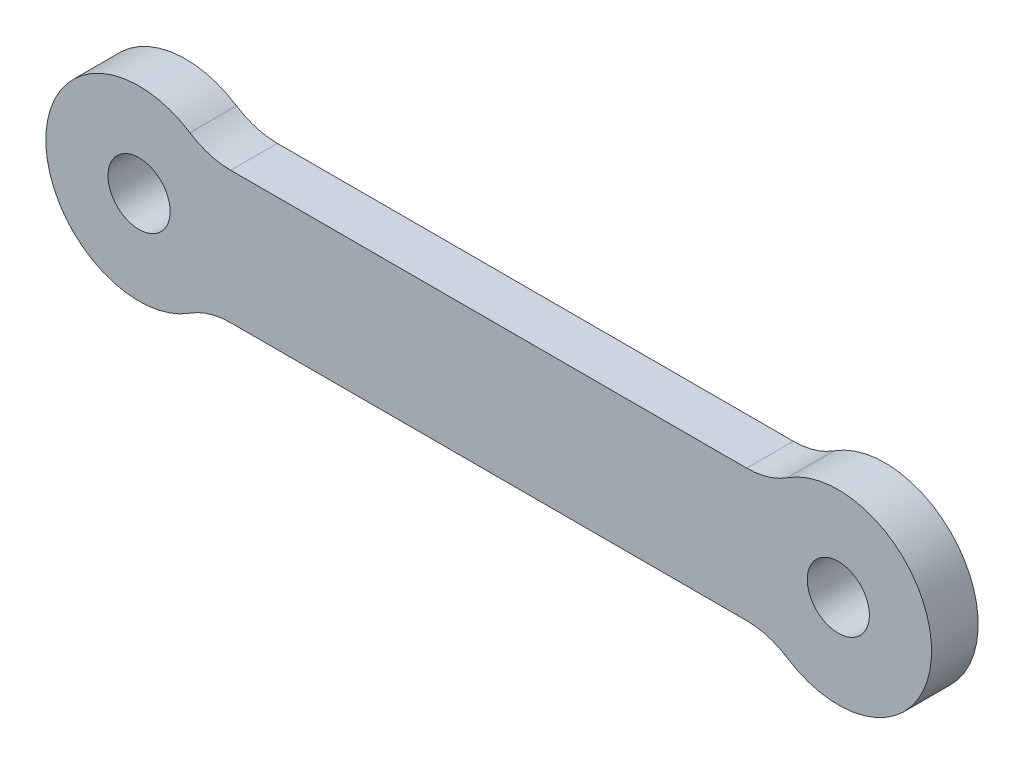
ISO-10303-21;
HEADER;
FILE_DESCRIPTION(('STEP AP214'),'2;1');
FILE_NAME('part.step','',(''),(''),'','','');
FILE_SCHEMA(('AUTOMOTIVE_DESIGN { 1 0 10303 214 1 1 1 1 }'));
ENDSEC;
DATA;
#1=APPLICATION_CONTEXT('core data for automotive mechanical design processes');
#2=APPLICATION_PROTOCOL_DEFINITION('international standard','automotive_design',2000,#1);
#3=PRODUCT_CONTEXT('',#1,'mechanical');
#4=PRODUCT('Part','Part','',(#3));
#5=PRODUCT_RELATED_PRODUCT_CATEGORY('part','',(#4));
#6=PRODUCT_DEFINITION_FORMATION('','',#4);
#7=PRODUCT_DEFINITION_CONTEXT('part definition',#1,'design');
#8=PRODUCT_DEFINITION('design','',#6,#7);
#9=PRODUCT_DEFINITION_SHAPE('','',#8);
#10=(LENGTH_UNIT() NAMED_UNIT(*) SI_UNIT(.MILLI.,.METRE.));
#11=(NAMED_UNIT(*) PLANE_ANGLE_UNIT() SI_UNIT($,.RADIAN.));
#12=(NAMED_UNIT(*) SI_UNIT($,.STERADIAN.) SOLID_ANGLE_UNIT());
#13=UNCERTAINTY_MEASURE_WITH_UNIT(LENGTH_MEASURE(1.E-05),#10,'distance_accuracy_value','');
#14=(GEOMETRIC_REPRESENTATION_CONTEXT(3) GLOBAL_UNCERTAINTY_ASSIGNED_CONTEXT((#13)) GLOBAL_UNIT_ASSIGNED_CONTEXT((#10,
#11,#12)) REPRESENTATION_CONTEXT('',''));
#15=CARTESIAN_POINT('',(0.,0.,0.));
#16=DIRECTION('',(0.,0.,1.));
#17=DIRECTION('',(1.,0.,0.));
#18=AXIS2_PLACEMENT_3D('',#15,#16,#17);
#19=CARTESIAN_POINT('',(39.1016416268752,-9.0651804279462,3.));
#20=DIRECTION('',(0.,0.,-1.));
#21=DIRECTION('',(-1.,0.,0.));
#22=AXIS2_PLACEMENT_3D('',#19,#20,#21);
#23=PLANE('',#22);
#24=CARTESIAN_POINT('',(39.1016416268752,-9.0651804279462,3.));
#25=DIRECTION('',(0.,0.,-1.));
#26=DIRECTION('',(-1.,0.,0.));
#27=AXIS2_PLACEMENT_3D('',#24,#25,#26);
#28=CIRCLE('',#27,4.8151804279462);
#29=CARTESIAN_POINT('',(39.1016416268752,-4.25,3.));
#30=VERTEX_POINT('',#29);
#31=CARTESIAN_POINT('',(41.727733718866,-5.02914241052621,3.));
#32=VERTEX_POINT('',#31);
#33=EDGE_CURVE('E154',#30,#32,#28,.T.);
#34=ORIENTED_EDGE('',*,*,#33,.T.);
#35=CARTESIAN_POINT('',(45.,0.,3.));
#36=DIRECTION('',(0.,0.,1.));
#37=DIRECTION('',(1.,0.,0.));
#38=AXIS2_PLACEMENT_3D('',#35,#36,#37);
#39=CIRCLE('',#38,6.);
#40=CARTESIAN_POINT('',(41.727733718866,5.02914241052621,3.));
#41=VERTEX_POINT('',#40);
#42=EDGE_CURVE('E103',#32,#41,#39,.T.);
#43=ORIENTED_EDGE('',*,*,#42,.T.);
#44=CARTESIAN_POINT('',(39.1016416268752,9.0651804279462,3.));
#45=DIRECTION('',(0.,0.,-1.));
#46=DIRECTION('',(1.,0.,0.));
#47=AXIS2_PLACEMENT_3D('',#44,#45,#46);
#48=CIRCLE('',#47,4.81518042794621);
#49=CARTESIAN_POINT('',(39.1016416268752,4.25,3.));
#50=VERTEX_POINT('',#49);
#51=EDGE_CURVE('E168',#41,#50,#48,.T.);
#52=ORIENTED_EDGE('',*,*,#51,.T.);
#53=DIRECTION('',(-1.,0.,0.));
#54=VECTOR('',#53,1.);
#55=CARTESIAN_POINT('',(5.89835837312483,4.25,3.));
#56=LINE('',#55,#54);
#57=CARTESIAN_POINT('',(5.89835837312483,4.25,3.));
#58=VERTEX_POINT('',#57);
#59=EDGE_CURVE('E181',#50,#58,#56,.T.);
#60=ORIENTED_EDGE('',*,*,#59,.T.);
#61=CARTESIAN_POINT('',(5.89835837312483,9.0651804279462,3.));
#62=DIRECTION('',(0.,0.,-1.));
#63=DIRECTION('',(-1.,0.,0.));
#64=AXIS2_PLACEMENT_3D('',#61,#62,#63);
#65=CIRCLE('',#64,4.8151804279462);
#66=CARTESIAN_POINT('',(3.27226628113402,5.02914241052621,3.));
#67=VERTEX_POINT('',#66);
#68=EDGE_CURVE('E124',#58,#67,#65,.T.);
#69=ORIENTED_EDGE('',*,*,#68,.T.);
#70=CARTESIAN_POINT('',(0.,0.,3.));
#71=DIRECTION('',(0.,0.,1.));
#72=DIRECTION('',(-1.,0.,0.));
#73=AXIS2_PLACEMENT_3D('',#70,#71,#72);
#74=CIRCLE('',#73,6.);
#75=CARTESIAN_POINT('',(3.27226628113402,-5.02914241052621,3.));
#76=VERTEX_POINT('',#75);
#77=EDGE_CURVE('E116',#67,#76,#74,.T.);
#78=ORIENTED_EDGE('',*,*,#77,.T.);
#79=CARTESIAN_POINT('',(5.89835837312483,-9.0651804279462,3.));
#80=DIRECTION('',(0.,0.,-1.));
#81=DIRECTION('',(1.,0.,0.));
#82=AXIS2_PLACEMENT_3D('',#79,#80,#81);
#83=CIRCLE('',#82,4.8151804279462);
#84=CARTESIAN_POINT('',(5.89835837312483,-4.25,3.));
#85=VERTEX_POINT('',#84);
#86=EDGE_CURVE('E119',#76,#85,#83,.T.);
#87=ORIENTED_EDGE('',*,*,#86,.T.);
#88=DIRECTION('',(1.,0.,0.));
#89=VECTOR('',#88,1.);
#90=CARTESIAN_POINT('',(5.89835837312483,-4.25,3.));
#91=LINE('',#90,#89);
#92=EDGE_CURVE('E58',#85,#30,#91,.T.);
#93=ORIENTED_EDGE('',*,*,#92,.T.);
#94=EDGE_LOOP('',(#34,#43,#52,#60,#69,#78,#87,#93));
#95=FACE_BOUND('',#94,.T.);
#96=CARTESIAN_POINT('',(0.,0.,3.));
#97=DIRECTION('',(0.,0.,1.));
#98=DIRECTION('',(1.,0.,0.));
#99=AXIS2_PLACEMENT_3D('',#96,#97,#98);
#100=CIRCLE('',#99,2.);
#101=CARTESIAN_POINT('',(2.,0.,3.));
#102=VERTEX_POINT('',#101);
#103=EDGE_CURVE('E145',#102,#102,#100,.T.);
#104=ORIENTED_EDGE('',*,*,#103,.F.);
#105=EDGE_LOOP('',(#104));
#106=FACE_BOUND('',#105,.T.);
#107=CARTESIAN_POINT('',(45.,0.,3.));
#108=DIRECTION('',(0.,0.,1.));
#109=DIRECTION('',(1.,0.,0.));
#110=AXIS2_PLACEMENT_3D('',#107,#108,#109);
#111=CIRCLE('',#110,2.);
#112=CARTESIAN_POINT('',(47.,0.,3.));
#113=VERTEX_POINT('',#112);
#114=EDGE_CURVE('E194',#113,#113,#111,.T.);
#115=ORIENTED_EDGE('',*,*,#114,.F.);
#116=EDGE_LOOP('',(#115));
#117=FACE_BOUND('',#116,.T.);
#118=ADVANCED_FACE('F43',(#95,#106,#117),#23,.F.);
#119=CARTESIAN_POINT('',(39.1016416268752,-9.0651804279462,0.));
#120=DIRECTION('',(0.,0.,-1.));
#121=DIRECTION('',(-1.,0.,0.));
#122=AXIS2_PLACEMENT_3D('',#119,#120,#121);
#123=PLANE('',#122);
#124=CARTESIAN_POINT('',(0.,0.,0.));
#125=DIRECTION('',(0.,0.,1.));
#126=DIRECTION('',(1.,0.,0.));
#127=AXIS2_PLACEMENT_3D('',#124,#125,#126);
#128=CIRCLE('',#127,2.);
#129=CARTESIAN_POINT('',(2.,0.,0.));
#130=VERTEX_POINT('',#129);
#131=EDGE_CURVE('E188',#130,#130,#128,.T.);
#132=ORIENTED_EDGE('',*,*,#131,.T.);
#133=EDGE_LOOP('',(#132));
#134=FACE_BOUND('',#133,.T.);
#135=CARTESIAN_POINT('',(39.1016416268752,-9.0651804279462,0.));
#136=DIRECTION('',(0.,0.,-1.));
#137=DIRECTION('',(-1.,0.,0.));
#138=AXIS2_PLACEMENT_3D('',#135,#136,#137);
#139=CIRCLE('',#138,4.8151804279462);
#140=CARTESIAN_POINT('',(39.1016416268752,-4.25,0.));
#141=VERTEX_POINT('',#140);
#142=CARTESIAN_POINT('',(41.727733718866,-5.02914241052621,0.));
#143=VERTEX_POINT('',#142);
#144=EDGE_CURVE('E138',#141,#143,#139,.T.);
#145=ORIENTED_EDGE('',*,*,#144,.F.);
#146=DIRECTION('',(1.,0.,0.));
#147=VECTOR('',#146,1.);
#148=CARTESIAN_POINT('',(5.89835837312483,-4.25,0.));
#149=LINE('',#148,#147);
#150=CARTESIAN_POINT('',(5.89835837312483,-4.25,0.));
#151=VERTEX_POINT('',#150);
#152=EDGE_CURVE('E92',#151,#141,#149,.T.);
#153=ORIENTED_EDGE('',*,*,#152,.F.);
#154=CARTESIAN_POINT('',(5.89835837312483,-9.0651804279462,0.));
#155=DIRECTION('',(0.,0.,-1.));
#156=DIRECTION('',(1.,0.,0.));
#157=AXIS2_PLACEMENT_3D('',#154,#155,#156);
#158=CIRCLE('',#157,4.8151804279462);
#159=CARTESIAN_POINT('',(3.27226628113402,-5.02914241052621,0.));
#160=VERTEX_POINT('',#159);
#161=EDGE_CURVE('E90',#160,#151,#158,.T.);
#162=ORIENTED_EDGE('',*,*,#161,.F.);
#163=CARTESIAN_POINT('',(0.,0.,0.));
#164=DIRECTION('',(0.,0.,1.));
#165=DIRECTION('',(-1.,0.,0.));
#166=AXIS2_PLACEMENT_3D('',#163,#164,#165);
#167=CIRCLE('',#166,6.);
#168=CARTESIAN_POINT('',(3.27226628113402,5.02914241052621,0.));
#169=VERTEX_POINT('',#168);
#170=EDGE_CURVE('E128',#169,#160,#167,.T.);
#171=ORIENTED_EDGE('',*,*,#170,.F.);
#172=CARTESIAN_POINT('',(5.89835837312483,9.0651804279462,0.));
#173=DIRECTION('',(0.,0.,-1.));
#174=DIRECTION('',(-1.,0.,0.));
#175=AXIS2_PLACEMENT_3D('',#172,#173,#174);
#176=CIRCLE('',#175,4.8151804279462);
#177=CARTESIAN_POINT('',(5.89835837312483,4.25,0.));
#178=VERTEX_POINT('',#177);
#179=EDGE_CURVE('E147',#178,#169,#176,.T.);
#180=ORIENTED_EDGE('',*,*,#179,.F.);
#181=DIRECTION('',(-1.,0.,0.));
#182=VECTOR('',#181,1.);
#183=CARTESIAN_POINT('',(5.89835837312483,4.25,0.));
#184=LINE('',#183,#182);
#185=CARTESIAN_POINT('',(39.1016416268752,4.25,0.));
#186=VERTEX_POINT('',#185);
#187=EDGE_CURVE('E146',#186,#178,#184,.T.);
#188=ORIENTED_EDGE('',*,*,#187,.F.);
#189=CARTESIAN_POINT('',(39.1016416268752,9.0651804279462,0.));
#190=DIRECTION('',(0.,0.,-1.));
#191=DIRECTION('',(1.,0.,0.));
#192=AXIS2_PLACEMENT_3D('',#189,#190,#191);
#193=CIRCLE('',#192,4.81518042794621);
#194=CARTESIAN_POINT('',(41.727733718866,5.02914241052621,0.));
#195=VERTEX_POINT('',#194);
#196=EDGE_CURVE('E148',#195,#186,#193,.T.);
#197=ORIENTED_EDGE('',*,*,#196,.F.);
#198=CARTESIAN_POINT('',(45.,0.,0.));
#199=DIRECTION('',(0.,0.,1.));
#200=DIRECTION('',(1.,0.,0.));
#201=AXIS2_PLACEMENT_3D('',#198,#199,#200);
#202=CIRCLE('',#201,6.);
#203=EDGE_CURVE('E141',#143,#195,#202,.T.);
#204=ORIENTED_EDGE('',*,*,#203,.F.);
#205=EDGE_LOOP('',(#145,#153,#162,#171,#180,#188,#197,#204));
#206=FACE_BOUND('',#205,.T.);
#207=CARTESIAN_POINT('',(45.,0.,0.));
#208=DIRECTION('',(0.,0.,1.));
#209=DIRECTION('',(1.,0.,0.));
#210=AXIS2_PLACEMENT_3D('',#207,#208,#209);
#211=CIRCLE('',#210,2.);
#212=CARTESIAN_POINT('',(47.,0.,0.));
#213=VERTEX_POINT('',#212);
#214=EDGE_CURVE('E193',#213,#213,#211,.T.);
#215=ORIENTED_EDGE('',*,*,#214,.T.);
#216=EDGE_LOOP('',(#215));
#217=FACE_BOUND('',#216,.T.);
#218=ADVANCED_FACE('F173',(#134,#206,#217),#123,.T.);
#219=CARTESIAN_POINT('',(39.1016416268752,-9.0651804279462,3.));
#220=DIRECTION('',(0.,0.,-1.));
#221=DIRECTION('',(-1.,0.,0.));
#222=AXIS2_PLACEMENT_3D('',#219,#220,#221);
#223=CYLINDRICAL_SURFACE('',#222,4.8151804279462);
#224=ORIENTED_EDGE('',*,*,#144,.T.);
#225=DIRECTION('',(0.,0.,-1.));
#226=VECTOR('',#225,1.);
#227=CARTESIAN_POINT('',(41.727733718866,-5.02914241052621,3.));
#228=LINE('',#227,#226);
#229=EDGE_CURVE('E11',#32,#143,#228,.T.);
#230=ORIENTED_EDGE('',*,*,#229,.F.);
#231=ORIENTED_EDGE('',*,*,#33,.F.);
#232=DIRECTION('',(0.,0.,-1.));
#233=VECTOR('',#232,1.);
#234=CARTESIAN_POINT('',(39.1016416268752,-4.25,3.));
#235=LINE('',#234,#233);
#236=EDGE_CURVE('E137',#30,#141,#235,.T.);
#237=ORIENTED_EDGE('',*,*,#236,.T.);
#238=EDGE_LOOP('',(#224,#230,#231,#237));
#239=FACE_BOUND('',#238,.T.);
#240=ADVANCED_FACE('F44',(#239),#223,.F.);
#241=CARTESIAN_POINT('',(45.,0.,3.));
#242=DIRECTION('',(0.,0.,-1.));
#243=DIRECTION('',(-1.,0.,0.));
#244=AXIS2_PLACEMENT_3D('',#241,#242,#243);
#245=CYLINDRICAL_SURFACE('',#244,6.);
#246=ORIENTED_EDGE('',*,*,#203,.T.);
#247=DIRECTION('',(0.,0.,-1.));
#248=VECTOR('',#247,1.);
#249=CARTESIAN_POINT('',(41.727733718866,5.02914241052621,3.));
#250=LINE('',#249,#248);
#251=EDGE_CURVE('E55',#41,#195,#250,.T.);
#252=ORIENTED_EDGE('',*,*,#251,.F.);
#253=ORIENTED_EDGE('',*,*,#42,.F.);
#254=ORIENTED_EDGE('',*,*,#229,.T.);
#255=EDGE_LOOP('',(#246,#252,#253,#254));
#256=FACE_BOUND('',#255,.T.);
#257=ADVANCED_FACE('F230',(#256),#245,.T.);
#258=CARTESIAN_POINT('',(39.1016416268752,9.0651804279462,3.));
#259=DIRECTION('',(0.,0.,-1.));
#260=DIRECTION('',(-1.,0.,0.));
#261=AXIS2_PLACEMENT_3D('',#258,#259,#260);
#262=CYLINDRICAL_SURFACE('',#261,4.81518042794621);
#263=ORIENTED_EDGE('',*,*,#196,.T.);
#264=DIRECTION('',(0.,0.,-1.));
#265=VECTOR('',#264,1.);
#266=CARTESIAN_POINT('',(39.1016416268752,4.25,3.));
#267=LINE('',#266,#265);
#268=EDGE_CURVE('E165',#50,#186,#267,.T.);
#269=ORIENTED_EDGE('',*,*,#268,.F.);
#270=ORIENTED_EDGE('',*,*,#51,.F.);
#271=ORIENTED_EDGE('',*,*,#251,.T.);
#272=EDGE_LOOP('',(#263,#269,#270,#271));
#273=FACE_BOUND('',#272,.T.);
#274=ADVANCED_FACE('F169',(#273),#262,.F.);
#275=CARTESIAN_POINT('',(5.89835837312483,4.25,3.));
#276=DIRECTION('',(0.,-1.,0.));
#277=DIRECTION('',(1.,0.,0.));
#278=AXIS2_PLACEMENT_3D('',#275,#276,#277);
#279=PLANE('',#278);
#280=ORIENTED_EDGE('',*,*,#187,.T.);
#281=DIRECTION('',(0.,0.,-1.));
#282=VECTOR('',#281,1.);
#283=CARTESIAN_POINT('',(5.89835837312483,4.25,3.));
#284=LINE('',#283,#282);
#285=EDGE_CURVE('E157',#58,#178,#284,.T.);
#286=ORIENTED_EDGE('',*,*,#285,.F.);
#287=ORIENTED_EDGE('',*,*,#59,.F.);
#288=ORIENTED_EDGE('',*,*,#268,.T.);
#289=EDGE_LOOP('',(#280,#286,#287,#288));
#290=FACE_BOUND('',#289,.T.);
#291=ADVANCED_FACE('F176',(#290),#279,.F.);
#292=CARTESIAN_POINT('',(5.89835837312483,9.0651804279462,3.));
#293=DIRECTION('',(0.,0.,-1.));
#294=DIRECTION('',(-1.,0.,0.));
#295=AXIS2_PLACEMENT_3D('',#292,#293,#294);
#296=CYLINDRICAL_SURFACE('',#295,4.8151804279462);
#297=ORIENTED_EDGE('',*,*,#179,.T.);
#298=DIRECTION('',(0.,0.,-1.));
#299=VECTOR('',#298,1.);
#300=CARTESIAN_POINT('',(3.27226628113402,5.02914241052621,3.));
#301=LINE('',#300,#299);
#302=EDGE_CURVE('E131',#67,#169,#301,.T.);
#303=ORIENTED_EDGE('',*,*,#302,.F.);
#304=ORIENTED_EDGE('',*,*,#68,.F.);
#305=ORIENTED_EDGE('',*,*,#285,.T.);
#306=EDGE_LOOP('',(#297,#303,#304,#305));
#307=FACE_BOUND('',#306,.T.);
#308=ADVANCED_FACE('F185',(#307),#296,.F.);
#309=CARTESIAN_POINT('',(0.,0.,3.));
#310=DIRECTION('',(0.,0.,-1.));
#311=DIRECTION('',(-1.,0.,0.));
#312=AXIS2_PLACEMENT_3D('',#309,#310,#311);
#313=CYLINDRICAL_SURFACE('',#312,6.);
#314=ORIENTED_EDGE('',*,*,#170,.T.);
#315=DIRECTION('',(0.,0.,-1.));
#316=VECTOR('',#315,1.);
#317=CARTESIAN_POINT('',(3.27226628113402,-5.02914241052621,3.));
#318=LINE('',#317,#316);
#319=EDGE_CURVE('E130',#76,#160,#318,.T.);
#320=ORIENTED_EDGE('',*,*,#319,.F.);
#321=ORIENTED_EDGE('',*,*,#77,.F.);
#322=ORIENTED_EDGE('',*,*,#302,.T.);
#323=EDGE_LOOP('',(#314,#320,#321,#322));
#324=FACE_BOUND('',#323,.T.);
#325=ADVANCED_FACE('F126',(#324),#313,.T.);
#326=CARTESIAN_POINT('',(5.89835837312483,-9.0651804279462,3.));
#327=DIRECTION('',(0.,0.,-1.));
#328=DIRECTION('',(-1.,0.,0.));
#329=AXIS2_PLACEMENT_3D('',#326,#327,#328);
#330=CYLINDRICAL_SURFACE('',#329,4.8151804279462);
#331=ORIENTED_EDGE('',*,*,#161,.T.);
#332=DIRECTION('',(0.,0.,-1.));
#333=VECTOR('',#332,1.);
#334=CARTESIAN_POINT('',(5.89835837312483,-4.25,3.));
#335=LINE('',#334,#333);
#336=EDGE_CURVE('E135',#85,#151,#335,.T.);
#337=ORIENTED_EDGE('',*,*,#336,.F.);
#338=ORIENTED_EDGE('',*,*,#86,.F.);
#339=ORIENTED_EDGE('',*,*,#319,.T.);
#340=EDGE_LOOP('',(#331,#337,#338,#339));
#341=FACE_BOUND('',#340,.T.);
#342=ADVANCED_FACE('F133',(#341),#330,.F.);
#343=CARTESIAN_POINT('',(5.89835837312483,-4.25,3.));
#344=DIRECTION('',(0.,1.,0.));
#345=DIRECTION('',(-1.,0.,0.));
#346=AXIS2_PLACEMENT_3D('',#343,#344,#345);
#347=PLANE('',#346);
#348=ORIENTED_EDGE('',*,*,#152,.T.);
#349=ORIENTED_EDGE('',*,*,#236,.F.);
#350=ORIENTED_EDGE('',*,*,#92,.F.);
#351=ORIENTED_EDGE('',*,*,#336,.T.);
#352=EDGE_LOOP('',(#348,#349,#350,#351));
#353=FACE_BOUND('',#352,.T.);
#354=ADVANCED_FACE('F214',(#353),#347,.F.);
#355=CARTESIAN_POINT('',(0.,0.,3.));
#356=DIRECTION('',(0.,0.,-1.));
#357=DIRECTION('',(-1.,0.,0.));
#358=AXIS2_PLACEMENT_3D('',#355,#356,#357);
#359=CYLINDRICAL_SURFACE('',#358,2.);
#360=ORIENTED_EDGE('',*,*,#103,.T.);
#361=EDGE_LOOP('',(#360));
#362=FACE_BOUND('',#361,.T.);
#363=ORIENTED_EDGE('',*,*,#131,.F.);
#364=EDGE_LOOP('',(#363));
#365=FACE_BOUND('',#364,.T.);
#366=ADVANCED_FACE('F215',(#362,#365),#359,.F.);
#367=CARTESIAN_POINT('',(45.,0.,3.));
#368=DIRECTION('',(0.,0.,-1.));
#369=DIRECTION('',(-1.,0.,0.));
#370=AXIS2_PLACEMENT_3D('',#367,#368,#369);
#371=CYLINDRICAL_SURFACE('',#370,2.);
#372=ORIENTED_EDGE('',*,*,#114,.T.);
#373=EDGE_LOOP('',(#372));
#374=FACE_BOUND('',#373,.T.);
#375=ORIENTED_EDGE('',*,*,#214,.F.);
#376=EDGE_LOOP('',(#375));
#377=FACE_BOUND('',#376,.T.);
#378=ADVANCED_FACE('F203',(#374,#377),#371,.F.);
#379=CLOSED_SHELL('',(#118,#218,#240,#257,#274,#291,#308,#325,#342,#354,#366,#378));
#380=MANIFOLD_SOLID_BREP('B2',#379);
#381=ADVANCED_BREP_SHAPE_REPRESENTATION('',(#18,#380),#14);
#382=SHAPE_DEFINITION_REPRESENTATION(#9,#381);
ENDSEC;
END-ISO-10303-21;
